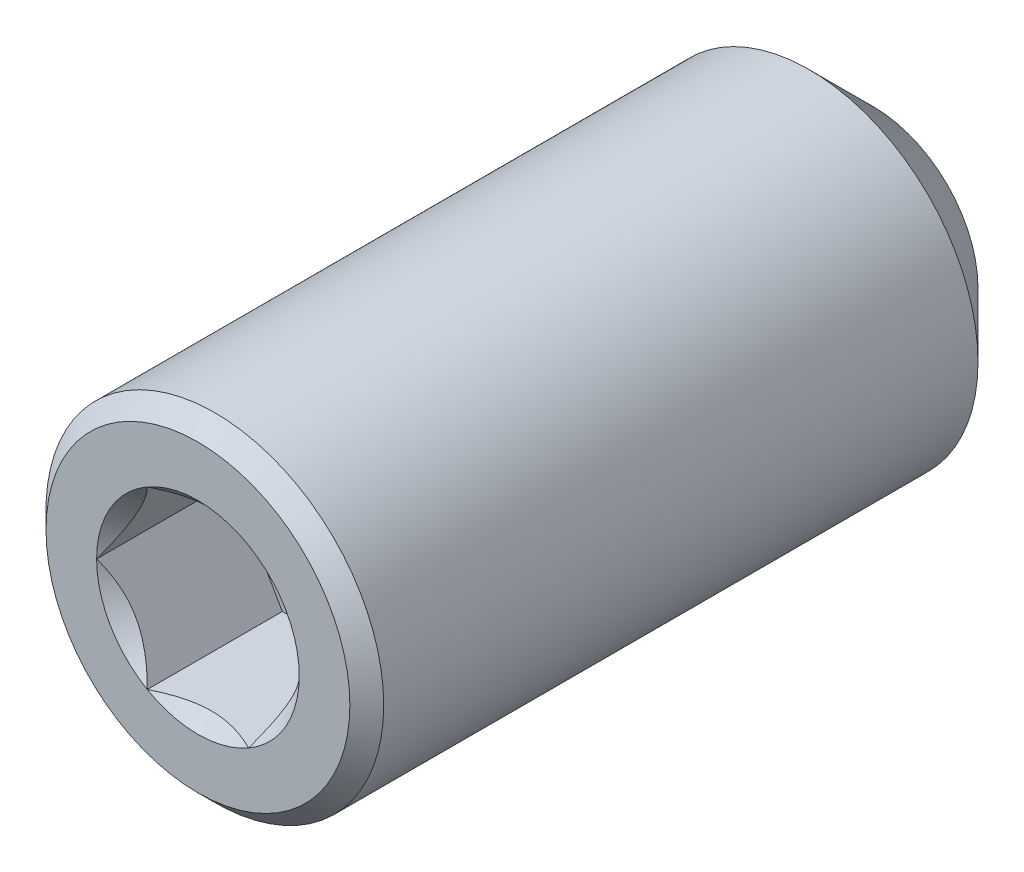
ISO-10303-21;
HEADER;
FILE_DESCRIPTION(('STEP AP214'),'2;1');
FILE_NAME('part.step','',(''),(''),'','','');
FILE_SCHEMA(('AUTOMOTIVE_DESIGN { 1 0 10303 214 1 1 1 1 }'));
ENDSEC;
DATA;
#1=APPLICATION_CONTEXT('core data for automotive mechanical design processes');
#2=APPLICATION_PROTOCOL_DEFINITION('international standard','automotive_design',2000,#1);
#3=PRODUCT_CONTEXT('',#1,'mechanical');
#4=PRODUCT('Part','Part','',(#3));
#5=PRODUCT_RELATED_PRODUCT_CATEGORY('part','',(#4));
#6=PRODUCT_DEFINITION_FORMATION('','',#4);
#7=PRODUCT_DEFINITION_CONTEXT('part definition',#1,'design');
#8=PRODUCT_DEFINITION('design','',#6,#7);
#9=PRODUCT_DEFINITION_SHAPE('','',#8);
#10=(LENGTH_UNIT() NAMED_UNIT(*) SI_UNIT(.MILLI.,.METRE.));
#11=(NAMED_UNIT(*) PLANE_ANGLE_UNIT() SI_UNIT($,.RADIAN.));
#12=(NAMED_UNIT(*) SI_UNIT($,.STERADIAN.) SOLID_ANGLE_UNIT());
#13=UNCERTAINTY_MEASURE_WITH_UNIT(LENGTH_MEASURE(1.E-05),#10,'distance_accuracy_value','');
#14=(GEOMETRIC_REPRESENTATION_CONTEXT(3) GLOBAL_UNCERTAINTY_ASSIGNED_CONTEXT((#13)) GLOBAL_UNIT_ASSIGNED_CONTEXT((#10,
#11,#12)) REPRESENTATION_CONTEXT('',''));
#15=CARTESIAN_POINT('',(0.,0.,0.));
#16=DIRECTION('',(0.,0.,1.));
#17=DIRECTION('',(1.,0.,0.));
#18=AXIS2_PLACEMENT_3D('',#15,#16,#17);
#19=CARTESIAN_POINT('',(0.,0.,-5.));
#20=DIRECTION('',(0.,0.,1.));
#21=DIRECTION('',(1.,0.,0.));
#22=AXIS2_PLACEMENT_3D('',#19,#20,#21);
#23=CYLINDRICAL_SURFACE('',#22,2.5);
#24=CARTESIAN_POINT('',(0.,0.,-4.0495));
#25=DIRECTION('',(0.,0.,-1.));
#26=DIRECTION('',(-1.,0.,0.));
#27=AXIS2_PLACEMENT_3D('',#24,#25,#26);
#28=CIRCLE('',#27,2.5);
#29=CARTESIAN_POINT('',(2.5,0.,-4.0495));
#30=VERTEX_POINT('',#29);
#31=EDGE_CURVE('E238',#30,#30,#28,.F.);
#32=ORIENTED_EDGE('',*,*,#31,.T.);
#33=EDGE_LOOP('',(#32));
#34=FACE_BOUND('',#33,.T.);
#35=CARTESIAN_POINT('',(0.,0.,4.7495));
#36=DIRECTION('',(0.,0.,1.));
#37=DIRECTION('',(1.,0.,0.));
#38=AXIS2_PLACEMENT_3D('',#35,#36,#37);
#39=CIRCLE('',#38,2.5);
#40=CARTESIAN_POINT('',(2.5,0.,4.7495));
#41=VERTEX_POINT('',#40);
#42=EDGE_CURVE('E233',#41,#41,#39,.F.);
#43=ORIENTED_EDGE('',*,*,#42,.T.);
#44=EDGE_LOOP('',(#43));
#45=FACE_BOUND('',#44,.T.);
#46=ADVANCED_FACE('F45',(#34,#45),#23,.T.);
#47=CARTESIAN_POINT('',(2.5,0.,-5.));
#48=DIRECTION('',(0.,0.,-1.));
#49=DIRECTION('',(-1.,0.,0.));
#50=AXIS2_PLACEMENT_3D('',#47,#48,#49);
#51=PLANE('',#50);
#52=CARTESIAN_POINT('',(0.,0.,-5.));
#53=DIRECTION('',(0.,0.,-1.));
#54=DIRECTION('',(-1.,0.,0.));
#55=AXIS2_PLACEMENT_3D('',#52,#53,#54);
#56=CIRCLE('',#55,1.5495);
#57=CARTESIAN_POINT('',(1.5495,0.,-5.));
#58=VERTEX_POINT('',#57);
#59=EDGE_CURVE('E60',#58,#58,#56,.T.);
#60=ORIENTED_EDGE('',*,*,#59,.T.);
#61=EDGE_LOOP('',(#60));
#62=FACE_BOUND('',#61,.T.);
#63=ADVANCED_FACE('F207',(#62),#51,.T.);
#64=CARTESIAN_POINT('',(0.,0.,5.));
#65=DIRECTION('',(0.,0.,1.));
#66=DIRECTION('',(1.,0.,0.));
#67=AXIS2_PLACEMENT_3D('',#64,#65,#66);
#68=PLANE('',#67);
#69=CARTESIAN_POINT('',(0.,0.,5.));
#70=DIRECTION('',(0.,0.,1.));
#71=DIRECTION('',(1.,0.,0.));
#72=AXIS2_PLACEMENT_3D('',#69,#70,#71);
#73=CIRCLE('',#72,2.2495);
#74=CARTESIAN_POINT('',(2.2495,0.,5.));
#75=VERTEX_POINT('',#74);
#76=EDGE_CURVE('E236',#75,#75,#73,.T.);
#77=ORIENTED_EDGE('',*,*,#76,.T.);
#78=EDGE_LOOP('',(#77));
#79=FACE_BOUND('',#78,.T.);
#80=CARTESIAN_POINT('',(0.,0.,5.));
#81=DIRECTION('',(0.,0.,1.));
#82=DIRECTION('',(1.,0.,0.));
#83=AXIS2_PLACEMENT_3D('',#80,#81,#82);
#84=CIRCLE('',#83,1.5);
#85=CARTESIAN_POINT('',(1.5,0.,5.));
#86=VERTEX_POINT('',#85);
#87=CARTESIAN_POINT('',(0.750000000000002,1.29903810567666,5.));
#88=VERTEX_POINT('',#87);
#89=EDGE_CURVE('E143',#86,#88,#84,.T.);
#90=ORIENTED_EDGE('',*,*,#89,.F.);
#91=CARTESIAN_POINT('',(0.749999999999997,-1.29903810567666,5.));
#92=VERTEX_POINT('',#91);
#93=EDGE_CURVE('E142',#92,#86,#84,.T.);
#94=ORIENTED_EDGE('',*,*,#93,.F.);
#95=CARTESIAN_POINT('',(-0.749999999999997,-1.29903810567666,5.));
#96=VERTEX_POINT('',#95);
#97=EDGE_CURVE('E112',#96,#92,#84,.T.);
#98=ORIENTED_EDGE('',*,*,#97,.F.);
#99=CARTESIAN_POINT('',(-1.5,0.,5.));
#100=VERTEX_POINT('',#99);
#101=EDGE_CURVE('E105',#100,#96,#84,.T.);
#102=ORIENTED_EDGE('',*,*,#101,.F.);
#103=CARTESIAN_POINT('',(-0.749999999999997,1.29903810567666,5.));
#104=VERTEX_POINT('',#103);
#105=EDGE_CURVE('E66',#104,#100,#84,.T.);
#106=ORIENTED_EDGE('',*,*,#105,.F.);
#107=EDGE_CURVE('E73',#88,#104,#84,.T.);
#108=ORIENTED_EDGE('',*,*,#107,.F.);
#109=EDGE_LOOP('',(#90,#94,#98,#102,#106,#108));
#110=FACE_BOUND('',#109,.T.);
#111=ADVANCED_FACE('F140',(#79,#110),#68,.T.);
#112=CARTESIAN_POINT('',(0.,0.,5.));
#113=DIRECTION('',(0.,0.,-1.));
#114=DIRECTION('',(-1.,0.,0.));
#115=AXIS2_PLACEMENT_3D('',#112,#113,#114);
#116=CONICAL_SURFACE('',#115,2.2495,0.785398163397452);
#117=ORIENTED_EDGE('',*,*,#42,.F.);
#118=EDGE_LOOP('',(#117));
#119=FACE_BOUND('',#118,.T.);
#120=ORIENTED_EDGE('',*,*,#76,.F.);
#121=EDGE_LOOP('',(#120));
#122=FACE_BOUND('',#121,.T.);
#123=ADVANCED_FACE('F219',(#119,#122),#116,.T.);
#124=CARTESIAN_POINT('',(0.,0.,-4.0495));
#125=DIRECTION('',(0.,0.,1.));
#126=DIRECTION('',(1.,0.,0.));
#127=AXIS2_PLACEMENT_3D('',#124,#125,#126);
#128=CONICAL_SURFACE('',#127,2.5,0.78539816339745);
#129=CARTESIAN_POINT('',(1.5495,0.,-5.));
#130=CARTESIAN_POINT('',(1.55940104166666,0.,-4.99009895833333));
#131=CARTESIAN_POINT('',(1.56930208333333,0.,-4.98019791666667));
#132=CARTESIAN_POINT('',(1.58910416666667,0.,-4.96039583333333));
#133=CARTESIAN_POINT('',(1.59900520833333,0.,-4.95049479166667));
#134=CARTESIAN_POINT('',(1.61880729166667,0.,-4.93069270833333));
#135=CARTESIAN_POINT('',(1.62870833333333,0.,-4.92079166666667));
#136=CARTESIAN_POINT('',(1.64851041666667,0.,-4.90098958333333));
#137=CARTESIAN_POINT('',(1.65841145833333,0.,-4.89108854166667));
#138=CARTESIAN_POINT('',(1.67821354166667,0.,-4.87128645833333));
#139=CARTESIAN_POINT('',(1.68811458333333,0.,-4.86138541666667));
#140=CARTESIAN_POINT('',(1.70791666666667,0.,-4.84158333333333));
#141=CARTESIAN_POINT('',(1.71781770833333,0.,-4.83168229166667));
#142=CARTESIAN_POINT('',(1.73761979166667,0.,-4.81188020833333));
#143=CARTESIAN_POINT('',(1.74752083333333,0.,-4.80197916666667));
#144=CARTESIAN_POINT('',(1.76732291666667,0.,-4.78217708333333));
#145=CARTESIAN_POINT('',(1.77722395833333,0.,-4.77227604166667));
#146=CARTESIAN_POINT('',(1.79702604166667,0.,-4.75247395833333));
#147=CARTESIAN_POINT('',(1.80692708333333,0.,-4.74257291666667));
#148=CARTESIAN_POINT('',(1.82672916666667,0.,-4.72277083333333));
#149=CARTESIAN_POINT('',(1.83663020833333,0.,-4.71286979166667));
#150=CARTESIAN_POINT('',(1.85643229166667,0.,-4.69306770833333));
#151=CARTESIAN_POINT('',(1.86633333333333,0.,-4.68316666666667));
#152=CARTESIAN_POINT('',(1.88613541666667,0.,-4.66336458333333));
#153=CARTESIAN_POINT('',(1.89603645833333,0.,-4.65346354166667));
#154=CARTESIAN_POINT('',(1.91583854166667,0.,-4.63366145833333));
#155=CARTESIAN_POINT('',(1.92573958333333,0.,-4.62376041666667));
#156=CARTESIAN_POINT('',(1.94554166666667,0.,-4.60395833333333));
#157=CARTESIAN_POINT('',(1.95544270833333,0.,-4.59405729166667));
#158=CARTESIAN_POINT('',(1.97524479166667,0.,-4.57425520833333));
#159=CARTESIAN_POINT('',(1.98514583333333,0.,-4.56435416666667));
#160=CARTESIAN_POINT('',(2.00494791666667,0.,-4.54455208333333));
#161=CARTESIAN_POINT('',(2.01484895833333,0.,-4.53465104166667));
#162=CARTESIAN_POINT('',(2.03465104166667,0.,-4.51484895833333));
#163=CARTESIAN_POINT('',(2.04455208333333,0.,-4.50494791666667));
#164=CARTESIAN_POINT('',(2.06435416666667,0.,-4.48514583333333));
#165=CARTESIAN_POINT('',(2.07425520833333,0.,-4.47524479166667));
#166=CARTESIAN_POINT('',(2.09405729166667,0.,-4.45544270833333));
#167=CARTESIAN_POINT('',(2.10395833333333,0.,-4.44554166666667));
#168=CARTESIAN_POINT('',(2.12376041666667,0.,-4.42573958333333));
#169=CARTESIAN_POINT('',(2.13366145833333,0.,-4.41583854166667));
#170=CARTESIAN_POINT('',(2.15346354166667,0.,-4.39603645833333));
#171=CARTESIAN_POINT('',(2.16336458333333,0.,-4.38613541666667));
#172=CARTESIAN_POINT('',(2.18316666666667,0.,-4.36633333333333));
#173=CARTESIAN_POINT('',(2.19306770833333,0.,-4.35643229166667));
#174=CARTESIAN_POINT('',(2.21286979166667,0.,-4.33663020833333));
#175=CARTESIAN_POINT('',(2.22277083333333,0.,-4.32672916666667));
#176=CARTESIAN_POINT('',(2.24257291666667,0.,-4.30692708333333));
#177=CARTESIAN_POINT('',(2.25247395833333,0.,-4.29702604166667));
#178=CARTESIAN_POINT('',(2.27227604166667,0.,-4.27722395833333));
#179=CARTESIAN_POINT('',(2.28217708333333,0.,-4.26732291666667));
#180=CARTESIAN_POINT('',(2.30197916666667,0.,-4.24752083333333));
#181=CARTESIAN_POINT('',(2.31188020833333,0.,-4.23761979166667));
#182=CARTESIAN_POINT('',(2.33168229166667,0.,-4.21781770833333));
#183=CARTESIAN_POINT('',(2.34158333333333,0.,-4.20791666666667));
#184=CARTESIAN_POINT('',(2.36138541666667,0.,-4.18811458333333));
#185=CARTESIAN_POINT('',(2.37128645833333,0.,-4.17821354166667));
#186=CARTESIAN_POINT('',(2.39108854166667,0.,-4.15841145833333));
#187=CARTESIAN_POINT('',(2.40098958333333,0.,-4.14851041666667));
#188=CARTESIAN_POINT('',(2.42079166666667,0.,-4.12870833333333));
#189=CARTESIAN_POINT('',(2.43069270833333,0.,-4.11880729166667));
#190=CARTESIAN_POINT('',(2.45049479166667,0.,-4.09900520833334));
#191=CARTESIAN_POINT('',(2.46039583333333,0.,-4.08910416666667));
#192=CARTESIAN_POINT('',(2.48019791666667,0.,-4.06930208333334));
#193=CARTESIAN_POINT('',(2.49009895833333,0.,-4.05940104166667));
#194=CARTESIAN_POINT('',(2.5,0.,-4.0495));
#195=B_SPLINE_CURVE_WITH_KNOTS('',3,(#129,#130,#131,#132,#133,#134,#135,#136,#137,#138,#139,
#140,#141,#142,#143,#144,#145,#146,#147,#148,#149,#150,#151,#152,#153,#154,#155,#156,#157,#158,
#159,#160,#161,#162,#163,#164,#165,#166,#167,#168,#169,#170,#171,#172,#173,#174,#175,#176,#177,
#178,#179,#180,#181,#182,#183,#184,#185,#186,#187,#188,#189,#190,#191,#192,#193,#194),
.UNSPECIFIED.,.F.,.F.,(4,2,2,2,2,2,2,2,2,2,2,2,2,2,2,2,2,2,2,2,2,2,2,2,2,2,2,2,2,2,2,2,4),(0.,
0.042006562219864,0.0840131244397271,0.12601968665959,0.168026248879454,0.210032811099317,
0.252039373319181,0.294045935539044,0.336052497758907,0.37805905997877,0.420065622198634,
0.462072184418497,0.504078746638361,0.546085308858224,0.588091871078087,0.63009843329795,
0.672104995517814,0.714111557737677,0.756118119957541,0.798124682177404,0.840131244397267,
0.88213780661713,0.924144368836994,0.966150931056858,1.00815749327672,1.05016405549658,
1.09217061771645,1.13417717993631,1.17618374215617,1.21819030437604,1.2601968665959,
1.30220342881576,1.34420999103563),.UNSPECIFIED.);
#196=EDGE_CURVE('BSEAM48',#58,#30,#195,.T.);
#197=ORIENTED_EDGE('',*,*,#59,.F.);
#198=ORIENTED_EDGE('',*,*,#31,.F.);
#199=ORIENTED_EDGE('',*,*,#196,.T.);
#200=ORIENTED_EDGE('',*,*,#196,.F.);
#201=EDGE_LOOP('',(#197,#199,#198,#200));
#202=FACE_BOUND('',#201,.T.);
#203=ADVANCED_FACE('F48',(#202),#128,.T.);
#204=CARTESIAN_POINT('',(0.,0.,3.50000000000002));
#205=DIRECTION('',(0.,0.,1.));
#206=DIRECTION('',(1.,0.,0.));
#207=AXIS2_PLACEMENT_3D('',#204,#205,#206);
#208=CONICAL_SURFACE('',#207,0.,0.785398163397453);
#209=CARTESIAN_POINT('',(2.87152034355963,-1.29903810567666,6.65168670452454));
#210=CARTESIAN_POINT('',(2.78735321526053,-1.29903810567666,6.57502498182543));
#211=CARTESIAN_POINT('',(2.70292089674321,-1.29903810567666,6.49864978210544));
#212=CARTESIAN_POINT('',(2.53330449265654,-1.29903810567666,6.34669505726628));
#213=CARTESIAN_POINT('',(2.44812021791155,-1.29903810567666,6.27111574350561));
#214=CARTESIAN_POINT('',(2.2761722753429,-1.29903810567666,6.12044614228815));
#215=CARTESIAN_POINT('',(2.18940152861747,-1.29903810567666,6.04536391260477));
#216=CARTESIAN_POINT('',(2.0146177340192,-1.29903810567666,5.89667796884861));
#217=CARTESIAN_POINT('',(1.9266048582402,-1.29903810567666,5.82307405331754));
#218=CARTESIAN_POINT('',(1.76161681515094,-1.29903810567666,5.68834750065274));
#219=CARTESIAN_POINT('',(1.68486824499871,-1.29903810567666,5.62694833127652));
#220=CARTESIAN_POINT('',(1.52971840742844,-1.29903810567666,5.5062788997863));
#221=CARTESIAN_POINT('',(1.45131732634047,-1.29903810567666,5.44700839966892));
#222=CARTESIAN_POINT('',(1.29238387574729,-1.29903810567666,5.33160196728615));
#223=CARTESIAN_POINT('',(1.2118545145099,-1.29903810567666,5.27546192643249));
#224=CARTESIAN_POINT('',(1.04779303871608,-1.29903810567666,5.1677933753008));
#225=CARTESIAN_POINT('',(0.964263021685265,-1.29903810567666,5.1162617283107));
#226=CARTESIAN_POINT('',(0.795836700895328,-1.29903810567666,5.021882208558));
#227=CARTESIAN_POINT('',(0.711068218933539,-1.29903810567666,4.97881037957471));
#228=CARTESIAN_POINT('',(0.536796240379313,-1.29903810567666,4.90340499220354));
#229=CARTESIAN_POINT('',(0.447303289565653,-1.29903810567666,4.87104860015817));
#230=CARTESIAN_POINT('',(0.318353114702283,-1.29903810567666,4.83699335254714));
#231=CARTESIAN_POINT('',(0.280682053533532,-1.29903810567666,4.82849091691322));
#232=CARTESIAN_POINT('',(0.204785514733903,-1.29903810567666,4.81455254796622));
#233=CARTESIAN_POINT('',(0.166560330148609,-1.29903810567666,4.80911505039569));
#234=CARTESIAN_POINT('',(0.0898479181375542,-1.29903810567666,4.80158316555224));
#235=CARTESIAN_POINT('',(0.0513612926488489,-1.29903810567666,4.79948272507251));
#236=CARTESIAN_POINT('',(-0.0256472149538551,-1.29903810567666,4.79872073381903));
#237=CARTESIAN_POINT('',(-0.0641690974616219,-1.29903810567666,4.80005922193326));
#238=CARTESIAN_POINT('',(-0.14084843713592,-1.29903810567666,4.80609353342873));
#239=CARTESIAN_POINT('',(-0.179006561759209,-1.29903810567666,4.81078101060029));
#240=CARTESIAN_POINT('',(-0.254812292728415,-1.29903810567666,4.82326507820572));
#241=CARTESIAN_POINT('',(-0.292459778958821,-1.29903810567666,4.83106238747487));
#242=CARTESIAN_POINT('',(-0.36716517116236,-1.29903810567666,4.84944223981946));
#243=CARTESIAN_POINT('',(-0.404221273853033,-1.29903810567666,4.86003202722346));
#244=CARTESIAN_POINT('',(-0.477553376274658,-1.29903810567666,4.8836017918164));
#245=CARTESIAN_POINT('',(-0.5138294157542,-1.29903810567666,4.89658164689416));
#246=CARTESIAN_POINT('',(-0.64731280970907,-1.29903810567666,4.94858616239856));
#247=CARTESIAN_POINT('',(-0.742021761555249,-1.29903810567666,4.99401375365276));
#248=CARTESIAN_POINT('',(-0.926659042320646,-1.29903810567666,5.09378410046732));
#249=CARTESIAN_POINT('',(-1.0165745038254,-1.29903810567666,5.14814939487779));
#250=CARTESIAN_POINT('',(-1.19370761083879,-1.29903810567666,5.26291304916409));
#251=CARTESIAN_POINT('',(-1.28088937028297,-1.29903810567666,5.32336621110583));
#252=CARTESIAN_POINT('',(-1.45265273389249,-1.29903810567666,5.44787395953166));
#253=CARTESIAN_POINT('',(-1.5372333667461,-1.29903810567666,5.51192986668825));
#254=CARTESIAN_POINT('',(-1.73094946573705,-1.29903810567666,5.66308369415209));
#255=CARTESIAN_POINT('',(-1.83939333463565,-1.29903810567666,5.75106348136573));
#256=CARTESIAN_POINT('',(-2.05412641165977,-1.29903810567666,5.92969458174789));
#257=CARTESIAN_POINT('',(-2.16041455059409,-1.29903810567666,6.02034716839164));
#258=CARTESIAN_POINT('',(-2.36810601905386,-1.29903810567666,6.20052408399478));
#259=CARTESIAN_POINT('',(-2.46955743137799,-1.29903810567666,6.28999318815272));
#260=CARTESIAN_POINT('',(-2.67129863998592,-1.29903810567666,6.47007634408007));
#261=CARTESIAN_POINT('',(-2.77158927893383,-1.29903810567666,6.56068945049902));
#262=CARTESIAN_POINT('',(-2.87152034355963,-1.29903810567666,6.65168670452454));
#263=B_SPLINE_CURVE_WITH_KNOTS('',3,(#209,#210,#211,#212,#213,#214,#215,#216,#217,#218,#219,
#220,#221,#222,#223,#224,#225,#226,#227,#228,#229,#230,#231,#232,#233,#234,#235,#236,#237,#238,
#239,#240,#241,#242,#243,#244,#245,#246,#247,#248,#249,#250,#251,#252,#253,#254,#255,#256,#257,
#258,#259,#260,#261,#262),.UNSPECIFIED.,.F.,.F.,(4,2,2,2,2,2,2,2,2,2,2,2,2,2,2,2,2,2,2,2,2,2,2,
2,2,2,4),(0.,0.341544873612004,0.68317827091417,1.02740301242702,1.37158052175005,
1.66641396687001,1.96121434381434,2.25561823245344,2.54982018460821,2.83467070085661,
3.11891026020783,3.23466042043454,3.35035145144807,3.46583238578788,3.58131462601116,
3.69651006567724,3.81173214812622,3.92725613509602,4.04277422145525,4.35694945479275,
4.67192947404365,4.99005343171566,5.30829477517983,5.72715586387072,6.14621985404204,
6.55200907392559,6.9574824548664),.UNSPECIFIED.);
#264=EDGE_CURVE('E11',#92,#96,#263,.T.);
#265=ORIENTED_EDGE('',*,*,#264,.T.);
#266=ORIENTED_EDGE('',*,*,#97,.T.);
#267=EDGE_LOOP('',(#265,#266));
#268=FACE_BOUND('',#267,.T.);
#269=ADVANCED_FACE('F117',(#268),#208,.F.);
#270=CARTESIAN_POINT('',(1.50011547005384,0.000200000000000278,5.00011548338614));
#271=CARTESIAN_POINT('',(1.47433064300946,-0.0444606305052422,4.9743494985627));
#272=CARTESIAN_POINT('',(1.44811462093373,-0.0898681127127577,4.95009650259488));
#273=CARTESIAN_POINT('',(1.39465705332699,-0.18245933585667,4.90568933220407));
#274=CARTESIAN_POINT('',(1.3674104206361,-0.229651888012453,4.88555987466373));
#275=CARTESIAN_POINT('',(1.312468850733,-0.324813478532235,4.85107742972859));
#276=CARTESIAN_POINT('',(1.28478791421429,-0.37275826698373,4.83663774623046));
#277=CARTESIAN_POINT('',(1.2288164604095,-0.46970366874711,4.81439016473135));
#278=CARTESIAN_POINT('',(1.20052765435952,-0.51870131811114,4.80656565239205));
#279=CARTESIAN_POINT('',(1.15177506217101,-0.603143284782326,4.79950587166564));
#280=CARTESIAN_POINT('',(1.13137428358312,-0.638478469810514,4.79846052017458));
#281=CARTESIAN_POINT('',(1.09060857958667,-0.709086740338683,4.80021988354317));
#282=CARTESIAN_POINT('',(1.07024366308336,-0.744359810414317,4.80302544805726));
#283=CARTESIAN_POINT('',(1.02971037328951,-0.81456552773517,4.81232446341913));
#284=CARTESIAN_POINT('',(1.00954220083877,-0.849497827115664,4.81882134850125));
#285=CARTESIAN_POINT('',(0.969542559159436,-0.91877923878882,4.83515308021827));
#286=CARTESIAN_POINT('',(0.949711238302666,-0.953128094093946,4.84498935966085));
#287=CARTESIAN_POINT('',(0.898920486458916,-1.04110025684194,4.87418168978958));
#288=CARTESIAN_POINT('',(0.86828129714236,-1.09416888944094,4.89573335197314));
#289=CARTESIAN_POINT('',(0.808202397535193,-1.19822859602338,4.94428137918113));
#290=CARTESIAN_POINT('',(0.778759149432787,-1.24922579767661,4.97126002685745));
#291=CARTESIAN_POINT('',(0.749884529946162,-1.29923810567666,5.00011548338615));
#292=B_SPLINE_CURVE_WITH_KNOTS('',3,(#270,#271,#272,#273,#274,#275,#276,#277,#278,#279,#280,
#281,#282,#283,#284,#285,#286,#287,#288,#289,#290,#291),.UNSPECIFIED.,.F.,.F.,(4,2,2,2,2,2,2,2,
2,2,4),(0.,0.173064448444911,0.347137721236259,0.518445290918302,0.689321323886852,
0.811592988288165,0.933891634676428,1.05630424883311,1.17876945212606,1.37331453622032,
1.56723451099525),.UNSPECIFIED.);
#293=EDGE_CURVE('E145',#86,#92,#292,.T.);
#294=ORIENTED_EDGE('',*,*,#293,.T.);
#295=ORIENTED_EDGE('',*,*,#93,.T.);
#296=EDGE_LOOP('',(#294,#295));
#297=FACE_BOUND('',#296,.T.);
#298=ADVANCED_FACE('F275',(#297),#208,.F.);
#299=CARTESIAN_POINT('',(0.749884529946162,1.29923810567666,5.00011548338615));
#300=CARTESIAN_POINT('',(0.775669356990543,1.25457747517142,4.97434949856271));
#301=CARTESIAN_POINT('',(0.801885379066275,1.2091699929639,4.95009650259488));
#302=CARTESIAN_POINT('',(0.85534294667301,1.11657876981999,4.90568933220407));
#303=CARTESIAN_POINT('',(0.882589579363896,1.06938621766421,4.88555987466373));
#304=CARTESIAN_POINT('',(0.937531149267005,0.974224627144423,4.85107742972859));
#305=CARTESIAN_POINT('',(0.965212085785716,0.926279838692928,4.83663774623046));
#306=CARTESIAN_POINT('',(1.0211835395905,0.829334436929547,4.81439016473135));
#307=CARTESIAN_POINT('',(1.04947234564048,0.780336787565517,4.80656565239205));
#308=CARTESIAN_POINT('',(1.09822493782899,0.695894820894331,4.79950587166564));
#309=CARTESIAN_POINT('',(1.11862571641688,0.660559635866143,4.79846052017458));
#310=CARTESIAN_POINT('',(1.15939142041333,0.589951365337974,4.80021988354317));
#311=CARTESIAN_POINT('',(1.17975633691665,0.55467829526234,4.80302544805726));
#312=CARTESIAN_POINT('',(1.22028962671049,0.484472577941488,4.81232446341913));
#313=CARTESIAN_POINT('',(1.24045779916123,0.449540278560993,4.81882134850125));
#314=CARTESIAN_POINT('',(1.28045744084057,0.380258866887837,4.83515308021827));
#315=CARTESIAN_POINT('',(1.30028876169734,0.345910011582712,4.84498935966085));
#316=CARTESIAN_POINT('',(1.35107951354109,0.257937848834714,4.87418168978958));
#317=CARTESIAN_POINT('',(1.38171870285764,0.204869216235718,4.89573335197314));
#318=CARTESIAN_POINT('',(1.44179760246481,0.100809509653274,4.94428137918113));
#319=CARTESIAN_POINT('',(1.47124085056721,0.0498123080000526,4.97126002685744));
#320=CARTESIAN_POINT('',(1.50011547005384,-0.000199999999999869,5.00011548338615));
#321=B_SPLINE_CURVE_WITH_KNOTS('',3,(#299,#300,#301,#302,#303,#304,#305,#306,#307,#308,#309,
#310,#311,#312,#313,#314,#315,#316,#317,#318,#319,#320),.UNSPECIFIED.,.F.,.F.,(4,2,2,2,2,2,2,2,
2,2,4),(0.,0.173064448444912,0.347137721236261,0.518445290918305,0.689321323886855,
0.811592988288168,0.933891634676431,1.05630424883312,1.17876945212606,1.37331453622032,
1.56723451099525),.UNSPECIFIED.);
#322=EDGE_CURVE('E152',#88,#86,#321,.T.);
#323=ORIENTED_EDGE('',*,*,#322,.T.);
#324=ORIENTED_EDGE('',*,*,#89,.T.);
#325=EDGE_LOOP('',(#323,#324));
#326=FACE_BOUND('',#325,.T.);
#327=ADVANCED_FACE('F273',(#326),#208,.F.);
#328=CARTESIAN_POINT('',(-2.87152034355963,1.29903810567666,6.65168670452454));
#329=CARTESIAN_POINT('',(-2.78735321526053,1.29903810567666,6.57502498182543));
#330=CARTESIAN_POINT('',(-2.70292089674321,1.29903810567666,6.49864978210544));
#331=CARTESIAN_POINT('',(-2.53330449265654,1.29903810567666,6.34669505726628));
#332=CARTESIAN_POINT('',(-2.44812021791155,1.29903810567666,6.27111574350561));
#333=CARTESIAN_POINT('',(-2.2761722753429,1.29903810567666,6.12044614228815));
#334=CARTESIAN_POINT('',(-2.18940152861747,1.29903810567666,6.04536391260477));
#335=CARTESIAN_POINT('',(-2.0146177340192,1.29903810567666,5.89667796884861));
#336=CARTESIAN_POINT('',(-1.9266048582402,1.29903810567666,5.82307405331754));
#337=CARTESIAN_POINT('',(-1.76161681515094,1.29903810567666,5.68834750065274));
#338=CARTESIAN_POINT('',(-1.68486824499871,1.29903810567666,5.62694833127652));
#339=CARTESIAN_POINT('',(-1.52971840742844,1.29903810567666,5.5062788997863));
#340=CARTESIAN_POINT('',(-1.45131732634047,1.29903810567666,5.44700839966892));
#341=CARTESIAN_POINT('',(-1.29238387574729,1.29903810567666,5.33160196728615));
#342=CARTESIAN_POINT('',(-1.2118545145099,1.29903810567666,5.27546192643249));
#343=CARTESIAN_POINT('',(-1.04779303871608,1.29903810567666,5.1677933753008));
#344=CARTESIAN_POINT('',(-0.964263021685265,1.29903810567666,5.1162617283107));
#345=CARTESIAN_POINT('',(-0.795836700895328,1.29903810567666,5.021882208558));
#346=CARTESIAN_POINT('',(-0.711068218933539,1.29903810567666,4.97881037957471));
#347=CARTESIAN_POINT('',(-0.536796240379313,1.29903810567666,4.90340499220354));
#348=CARTESIAN_POINT('',(-0.447303289565653,1.29903810567666,4.87104860015817));
#349=CARTESIAN_POINT('',(-0.318353114702283,1.29903810567666,4.83699335254714));
#350=CARTESIAN_POINT('',(-0.280682053533532,1.29903810567666,4.82849091691322));
#351=CARTESIAN_POINT('',(-0.204785514733903,1.29903810567666,4.81455254796622));
#352=CARTESIAN_POINT('',(-0.166560330148609,1.29903810567666,4.80911505039569));
#353=CARTESIAN_POINT('',(-0.0898479181375542,1.29903810567666,4.80158316555224));
#354=CARTESIAN_POINT('',(-0.0513612926488489,1.29903810567666,4.79948272507251));
#355=CARTESIAN_POINT('',(0.0256472149538551,1.29903810567666,4.79872073381903));
#356=CARTESIAN_POINT('',(0.0641690974616219,1.29903810567666,4.80005922193326));
#357=CARTESIAN_POINT('',(0.14084843713592,1.29903810567666,4.80609353342873));
#358=CARTESIAN_POINT('',(0.179006561759209,1.29903810567666,4.81078101060029));
#359=CARTESIAN_POINT('',(0.254812292728415,1.29903810567666,4.82326507820572));
#360=CARTESIAN_POINT('',(0.292459778958821,1.29903810567666,4.83106238747487));
#361=CARTESIAN_POINT('',(0.36716517116236,1.29903810567666,4.84944223981946));
#362=CARTESIAN_POINT('',(0.404221273853033,1.29903810567666,4.86003202722346));
#363=CARTESIAN_POINT('',(0.477553376274658,1.29903810567666,4.8836017918164));
#364=CARTESIAN_POINT('',(0.5138294157542,1.29903810567666,4.89658164689416));
#365=CARTESIAN_POINT('',(0.64731280970907,1.29903810567666,4.94858616239856));
#366=CARTESIAN_POINT('',(0.742021761555249,1.29903810567666,4.99401375365276));
#367=CARTESIAN_POINT('',(0.926659042320646,1.29903810567666,5.09378410046732));
#368=CARTESIAN_POINT('',(1.0165745038254,1.29903810567666,5.14814939487779));
#369=CARTESIAN_POINT('',(1.19370761083879,1.29903810567666,5.26291304916409));
#370=CARTESIAN_POINT('',(1.28088937028297,1.29903810567666,5.32336621110583));
#371=CARTESIAN_POINT('',(1.45265273389249,1.29903810567666,5.44787395953166));
#372=CARTESIAN_POINT('',(1.5372333667461,1.29903810567666,5.51192986668825));
#373=CARTESIAN_POINT('',(1.73094946573705,1.29903810567666,5.66308369415209));
#374=CARTESIAN_POINT('',(1.83939333463565,1.29903810567666,5.75106348136573));
#375=CARTESIAN_POINT('',(2.05412641165977,1.29903810567666,5.92969458174789));
#376=CARTESIAN_POINT('',(2.16041455059409,1.29903810567666,6.02034716839164));
#377=CARTESIAN_POINT('',(2.36810601905386,1.29903810567666,6.20052408399478));
#378=CARTESIAN_POINT('',(2.46955743137799,1.29903810567666,6.28999318815272));
#379=CARTESIAN_POINT('',(2.67129863998592,1.29903810567666,6.47007634408007));
#380=CARTESIAN_POINT('',(2.77158927893383,1.29903810567666,6.56068945049902));
#381=CARTESIAN_POINT('',(2.87152034355963,1.29903810567666,6.65168670452454));
#382=B_SPLINE_CURVE_WITH_KNOTS('',3,(#328,#329,#330,#331,#332,#333,#334,#335,#336,#337,#338,
#339,#340,#341,#342,#343,#344,#345,#346,#347,#348,#349,#350,#351,#352,#353,#354,#355,#356,#357,
#358,#359,#360,#361,#362,#363,#364,#365,#366,#367,#368,#369,#370,#371,#372,#373,#374,#375,#376,
#377,#378,#379,#380,#381),.UNSPECIFIED.,.F.,.F.,(4,2,2,2,2,2,2,2,2,2,2,2,2,2,2,2,2,2,2,2,2,2,2,
2,2,2,4),(0.,0.341544873612004,0.68317827091417,1.02740301242702,1.37158052175005,
1.66641396687001,1.96121434381434,2.25561823245344,2.54982018460821,2.83467070085661,
3.11891026020783,3.23466042043454,3.35035145144807,3.46583238578788,3.58131462601116,
3.69651006567724,3.81173214812622,3.92725613509602,4.04277422145525,4.35694945479275,
4.67192947404365,4.99005343171566,5.30829477517983,5.72715586387072,6.14621985404204,
6.55200907392559,6.9574824548664),.UNSPECIFIED.);
#383=EDGE_CURVE('E172',#104,#88,#382,.T.);
#384=ORIENTED_EDGE('',*,*,#383,.T.);
#385=ORIENTED_EDGE('',*,*,#107,.T.);
#386=EDGE_LOOP('',(#384,#385));
#387=FACE_BOUND('',#386,.T.);
#388=ADVANCED_FACE('F284',(#387),#208,.F.);
#389=CARTESIAN_POINT('',(-1.50011547005384,-0.000199999999999748,5.00011548338614));
#390=CARTESIAN_POINT('',(-1.47433064300946,0.0444606305052427,4.9743494985627));
#391=CARTESIAN_POINT('',(-1.44811462093373,0.0898681127127582,4.95009650259488));
#392=CARTESIAN_POINT('',(-1.39465705332699,0.182459335856671,4.90568933220407));
#393=CARTESIAN_POINT('',(-1.3674104206361,0.229651888012454,4.88555987466373));
#394=CARTESIAN_POINT('',(-1.312468850733,0.324813478532236,4.85107742972859));
#395=CARTESIAN_POINT('',(-1.28478791421428,0.372758266983731,4.83663774623046));
#396=CARTESIAN_POINT('',(-1.2288164604095,0.469703668747111,4.81439016473135));
#397=CARTESIAN_POINT('',(-1.20052765435952,0.518701318111142,4.80656565239205));
#398=CARTESIAN_POINT('',(-1.15177506217101,0.603143284782327,4.79950587166564));
#399=CARTESIAN_POINT('',(-1.13137428358312,0.638478469810515,4.79846052017458));
#400=CARTESIAN_POINT('',(-1.09060857958667,0.709086740338684,4.80021988354317));
#401=CARTESIAN_POINT('',(-1.07024366308336,0.744359810414318,4.80302544805726));
#402=CARTESIAN_POINT('',(-1.02971037328951,0.81456552773517,4.81232446341913));
#403=CARTESIAN_POINT('',(-1.00954220083877,0.849497827115665,4.81882134850125));
#404=CARTESIAN_POINT('',(-0.969542559159436,0.918779238788821,4.83515308021827));
#405=CARTESIAN_POINT('',(-0.949711238302666,0.953128094093946,4.84498935966085));
#406=CARTESIAN_POINT('',(-0.898920486458916,1.04110025684194,4.87418168978958));
#407=CARTESIAN_POINT('',(-0.86828129714236,1.09416888944094,4.89573335197314));
#408=CARTESIAN_POINT('',(-0.808202397535192,1.19822859602338,4.94428137918113));
#409=CARTESIAN_POINT('',(-0.778759149432787,1.24922579767661,4.97126002685745));
#410=CARTESIAN_POINT('',(-0.749884529946162,1.29923810567666,5.00011548338615));
#411=B_SPLINE_CURVE_WITH_KNOTS('',3,(#389,#390,#391,#392,#393,#394,#395,#396,#397,#398,#399,
#400,#401,#402,#403,#404,#405,#406,#407,#408,#409,#410),.UNSPECIFIED.,.F.,.F.,(4,2,2,2,2,2,2,2,
2,2,4),(0.,0.173064448444911,0.347137721236259,0.518445290918303,0.689321323886852,
0.811592988288165,0.933891634676428,1.05630424883311,1.17876945212606,1.37331453622032,
1.56723451099525),.UNSPECIFIED.);
#412=EDGE_CURVE('E129',#100,#104,#411,.T.);
#413=ORIENTED_EDGE('',*,*,#412,.T.);
#414=ORIENTED_EDGE('',*,*,#105,.T.);
#415=EDGE_LOOP('',(#413,#414));
#416=FACE_BOUND('',#415,.T.);
#417=ADVANCED_FACE('F165',(#416),#208,.F.);
#418=CARTESIAN_POINT('',(-0.749884529946162,-1.29923810567666,5.00011548338615));
#419=CARTESIAN_POINT('',(-0.775669356990543,-1.25457747517142,4.97434949856271));
#420=CARTESIAN_POINT('',(-0.801885379066275,-1.2091699929639,4.95009650259488));
#421=CARTESIAN_POINT('',(-0.855342946673009,-1.11657876981999,4.90568933220407));
#422=CARTESIAN_POINT('',(-0.882589579363896,-1.06938621766421,4.88555987466373));
#423=CARTESIAN_POINT('',(-0.937531149267005,-0.974224627144423,4.85107742972859));
#424=CARTESIAN_POINT('',(-0.965212085785716,-0.926279838692928,4.83663774623046));
#425=CARTESIAN_POINT('',(-1.0211835395905,-0.829334436929547,4.81439016473135));
#426=CARTESIAN_POINT('',(-1.04947234564048,-0.780336787565517,4.80656565239205));
#427=CARTESIAN_POINT('',(-1.09822493782899,-0.69589482089433,4.79950587166564));
#428=CARTESIAN_POINT('',(-1.11862571641688,-0.660559635866143,4.79846052017458));
#429=CARTESIAN_POINT('',(-1.15939142041333,-0.589951365337974,4.80021988354317));
#430=CARTESIAN_POINT('',(-1.17975633691665,-0.55467829526234,4.80302544805726));
#431=CARTESIAN_POINT('',(-1.22028962671049,-0.484472577941487,4.81232446341913));
#432=CARTESIAN_POINT('',(-1.24045779916123,-0.449540278560993,4.81882134850125));
#433=CARTESIAN_POINT('',(-1.28045744084057,-0.380258866887837,4.83515308021827));
#434=CARTESIAN_POINT('',(-1.30028876169734,-0.345910011582711,4.84498935966085));
#435=CARTESIAN_POINT('',(-1.35107951354109,-0.257937848834713,4.87418168978958));
#436=CARTESIAN_POINT('',(-1.38171870285764,-0.204869216235717,4.89573335197314));
#437=CARTESIAN_POINT('',(-1.44179760246481,-0.100809509653274,4.94428137918113));
#438=CARTESIAN_POINT('',(-1.47124085056721,-0.0498123080000521,4.97126002685744));
#439=CARTESIAN_POINT('',(-1.50011547005384,0.000200000000000385,5.00011548338615));
#440=B_SPLINE_CURVE_WITH_KNOTS('',3,(#418,#419,#420,#421,#422,#423,#424,#425,#426,#427,#428,
#429,#430,#431,#432,#433,#434,#435,#436,#437,#438,#439),.UNSPECIFIED.,.F.,.F.,(4,2,2,2,2,2,2,2,
2,2,4),(0.,0.173064448444912,0.347137721236261,0.518445290918305,0.689321323886856,
0.811592988288169,0.933891634676431,1.05630424883312,1.17876945212606,1.37331453622032,
1.56723451099525),.UNSPECIFIED.);
#441=EDGE_CURVE('E108',#96,#100,#440,.T.);
#442=ORIENTED_EDGE('',*,*,#441,.T.);
#443=ORIENTED_EDGE('',*,*,#101,.T.);
#444=EDGE_LOOP('',(#442,#443));
#445=FACE_BOUND('',#444,.T.);
#446=ADVANCED_FACE('F106',(#445),#208,.F.);
#447=CARTESIAN_POINT('',(0.,0.,3.));
#448=DIRECTION('',(0.,0.,1.));
#449=DIRECTION('',(1.,0.,0.));
#450=AXIS2_PLACEMENT_3D('',#447,#448,#449);
#451=PLANE('',#450);
#452=DIRECTION('',(0.499999999999999,-0.866025403784439,0.));
#453=VECTOR('',#452,1.);
#454=CARTESIAN_POINT('',(-1.5,0.,3.));
#455=LINE('',#454,#453);
#456=CARTESIAN_POINT('',(-1.5,0.,3.));
#457=VERTEX_POINT('',#456);
#458=CARTESIAN_POINT('',(-0.75,-1.29903810567666,3.));
#459=VERTEX_POINT('',#458);
#460=EDGE_CURVE('E128',#457,#459,#455,.T.);
#461=ORIENTED_EDGE('',*,*,#460,.T.);
#462=DIRECTION('',(1.,0.,0.));
#463=VECTOR('',#462,1.);
#464=CARTESIAN_POINT('',(-0.75,-1.29903810567666,3.));
#465=LINE('',#464,#463);
#466=CARTESIAN_POINT('',(0.75,-1.29903810567666,3.));
#467=VERTEX_POINT('',#466);
#468=EDGE_CURVE('E133',#459,#467,#465,.T.);
#469=ORIENTED_EDGE('',*,*,#468,.T.);
#470=DIRECTION('',(0.499999999999999,0.866025403784439,0.));
#471=VECTOR('',#470,1.);
#472=CARTESIAN_POINT('',(0.75,-1.29903810567666,3.));
#473=LINE('',#472,#471);
#474=CARTESIAN_POINT('',(1.5,0.,3.));
#475=VERTEX_POINT('',#474);
#476=EDGE_CURVE('E264',#467,#475,#473,.T.);
#477=ORIENTED_EDGE('',*,*,#476,.T.);
#478=DIRECTION('',(-0.5,0.866025403784439,0.));
#479=VECTOR('',#478,1.);
#480=CARTESIAN_POINT('',(1.5,0.,3.));
#481=LINE('',#480,#479);
#482=CARTESIAN_POINT('',(0.75,1.29903810567666,3.));
#483=VERTEX_POINT('',#482);
#484=EDGE_CURVE('E261',#475,#483,#481,.T.);
#485=ORIENTED_EDGE('',*,*,#484,.T.);
#486=DIRECTION('',(-1.,0.,0.));
#487=VECTOR('',#486,1.);
#488=CARTESIAN_POINT('',(0.75,1.29903810567666,3.));
#489=LINE('',#488,#487);
#490=CARTESIAN_POINT('',(-0.75,1.29903810567666,3.));
#491=VERTEX_POINT('',#490);
#492=EDGE_CURVE('E258',#483,#491,#489,.T.);
#493=ORIENTED_EDGE('',*,*,#492,.T.);
#494=DIRECTION('',(-0.5,-0.866025403784439,0.));
#495=VECTOR('',#494,1.);
#496=CARTESIAN_POINT('',(-0.75,1.29903810567666,3.));
#497=LINE('',#496,#495);
#498=EDGE_CURVE('E136',#491,#457,#497,.T.);
#499=ORIENTED_EDGE('',*,*,#498,.T.);
#500=EDGE_LOOP('',(#461,#469,#477,#485,#493,#499));
#501=FACE_BOUND('',#500,.T.);
#502=ADVANCED_FACE('F164',(#501),#451,.T.);
#503=CARTESIAN_POINT('',(-0.75,-1.29903810567666,3.));
#504=DIRECTION('',(0.,-1.,0.));
#505=DIRECTION('',(0.,0.,-1.));
#506=AXIS2_PLACEMENT_3D('',#503,#504,#505);
#507=PLANE('',#506);
#508=ORIENTED_EDGE('',*,*,#264,.F.);
#509=DIRECTION('',(0.,0.,1.));
#510=VECTOR('',#509,1.);
#511=CARTESIAN_POINT('',(0.75,-1.29903810567666,3.));
#512=LINE('',#511,#510);
#513=EDGE_CURVE('E135',#467,#92,#512,.T.);
#514=ORIENTED_EDGE('',*,*,#513,.F.);
#515=ORIENTED_EDGE('',*,*,#468,.F.);
#516=DIRECTION('',(0.,0.,1.));
#517=VECTOR('',#516,1.);
#518=CARTESIAN_POINT('',(-0.75,-1.29903810567666,3.));
#519=LINE('',#518,#517);
#520=EDGE_CURVE('E125',#459,#96,#519,.T.);
#521=ORIENTED_EDGE('',*,*,#520,.T.);
#522=EDGE_LOOP('',(#508,#514,#515,#521));
#523=FACE_BOUND('',#522,.T.);
#524=ADVANCED_FACE('F131',(#523),#507,.F.);
#525=CARTESIAN_POINT('',(0.75,-1.29903810567666,3.));
#526=DIRECTION('',(0.866025403784439,-0.499999999999999,0.));
#527=DIRECTION('',(0.499999999999999,0.866025403784439,0.));
#528=AXIS2_PLACEMENT_3D('',#525,#526,#527);
#529=PLANE('',#528);
#530=ORIENTED_EDGE('',*,*,#293,.F.);
#531=DIRECTION('',(0.,0.,1.));
#532=VECTOR('',#531,1.);
#533=CARTESIAN_POINT('',(1.5,0.,3.));
#534=LINE('',#533,#532);
#535=EDGE_CURVE('E249',#475,#86,#534,.T.);
#536=ORIENTED_EDGE('',*,*,#535,.F.);
#537=ORIENTED_EDGE('',*,*,#476,.F.);
#538=ORIENTED_EDGE('',*,*,#513,.T.);
#539=EDGE_LOOP('',(#530,#536,#537,#538));
#540=FACE_BOUND('',#539,.T.);
#541=ADVANCED_FACE('F159',(#540),#529,.F.);
#542=CARTESIAN_POINT('',(1.5,0.,3.));
#543=DIRECTION('',(0.866025403784439,0.5,0.));
#544=DIRECTION('',(-0.5,0.866025403784439,0.));
#545=AXIS2_PLACEMENT_3D('',#542,#543,#544);
#546=PLANE('',#545);
#547=ORIENTED_EDGE('',*,*,#322,.F.);
#548=DIRECTION('',(0.,0.,1.));
#549=VECTOR('',#548,1.);
#550=CARTESIAN_POINT('',(0.75,1.29903810567666,3.));
#551=LINE('',#550,#549);
#552=EDGE_CURVE('E251',#483,#88,#551,.T.);
#553=ORIENTED_EDGE('',*,*,#552,.F.);
#554=ORIENTED_EDGE('',*,*,#484,.F.);
#555=ORIENTED_EDGE('',*,*,#535,.T.);
#556=EDGE_LOOP('',(#547,#553,#554,#555));
#557=FACE_BOUND('',#556,.T.);
#558=ADVANCED_FACE('F196',(#557),#546,.F.);
#559=CARTESIAN_POINT('',(0.75,1.29903810567666,3.));
#560=DIRECTION('',(0.,1.,0.));
#561=DIRECTION('',(0.,0.,1.));
#562=AXIS2_PLACEMENT_3D('',#559,#560,#561);
#563=PLANE('',#562);
#564=ORIENTED_EDGE('',*,*,#383,.F.);
#565=DIRECTION('',(0.,0.,1.));
#566=VECTOR('',#565,1.);
#567=CARTESIAN_POINT('',(-0.75,1.29903810567666,3.));
#568=LINE('',#567,#566);
#569=EDGE_CURVE('E240',#491,#104,#568,.T.);
#570=ORIENTED_EDGE('',*,*,#569,.F.);
#571=ORIENTED_EDGE('',*,*,#492,.F.);
#572=ORIENTED_EDGE('',*,*,#552,.T.);
#573=EDGE_LOOP('',(#564,#570,#571,#572));
#574=FACE_BOUND('',#573,.T.);
#575=ADVANCED_FACE('F192',(#574),#563,.F.);
#576=CARTESIAN_POINT('',(-0.75,1.29903810567666,3.));
#577=DIRECTION('',(-0.866025403784439,0.5,0.));
#578=DIRECTION('',(-0.5,-0.866025403784439,0.));
#579=AXIS2_PLACEMENT_3D('',#576,#577,#578);
#580=PLANE('',#579);
#581=ORIENTED_EDGE('',*,*,#412,.F.);
#582=DIRECTION('',(0.,0.,1.));
#583=VECTOR('',#582,1.);
#584=CARTESIAN_POINT('',(-1.5,0.,3.));
#585=LINE('',#584,#583);
#586=EDGE_CURVE('E127',#457,#100,#585,.T.);
#587=ORIENTED_EDGE('',*,*,#586,.F.);
#588=ORIENTED_EDGE('',*,*,#498,.F.);
#589=ORIENTED_EDGE('',*,*,#569,.T.);
#590=EDGE_LOOP('',(#581,#587,#588,#589));
#591=FACE_BOUND('',#590,.T.);
#592=ADVANCED_FACE('F189',(#591),#580,.F.);
#593=CARTESIAN_POINT('',(-1.5,0.,3.));
#594=DIRECTION('',(-0.866025403784439,-0.499999999999999,0.));
#595=DIRECTION('',(0.499999999999999,-0.866025403784439,0.));
#596=AXIS2_PLACEMENT_3D('',#593,#594,#595);
#597=PLANE('',#596);
#598=ORIENTED_EDGE('',*,*,#441,.F.);
#599=ORIENTED_EDGE('',*,*,#520,.F.);
#600=ORIENTED_EDGE('',*,*,#460,.F.);
#601=ORIENTED_EDGE('',*,*,#586,.T.);
#602=EDGE_LOOP('',(#598,#599,#600,#601));
#603=FACE_BOUND('',#602,.T.);
#604=ADVANCED_FACE('F123',(#603),#597,.F.);
#605=CLOSED_SHELL('',(#46,#63,#111,#123,#203,#269,#298,#327,#388,#417,#446,#502,#524,#541,#558,
#575,#592,#604));
#606=MANIFOLD_SOLID_BREP('B2',#605);
#607=ADVANCED_BREP_SHAPE_REPRESENTATION('',(#18,#606),#14);
#608=SHAPE_DEFINITION_REPRESENTATION(#9,#607);
ENDSEC;
END-ISO-10303-21;
